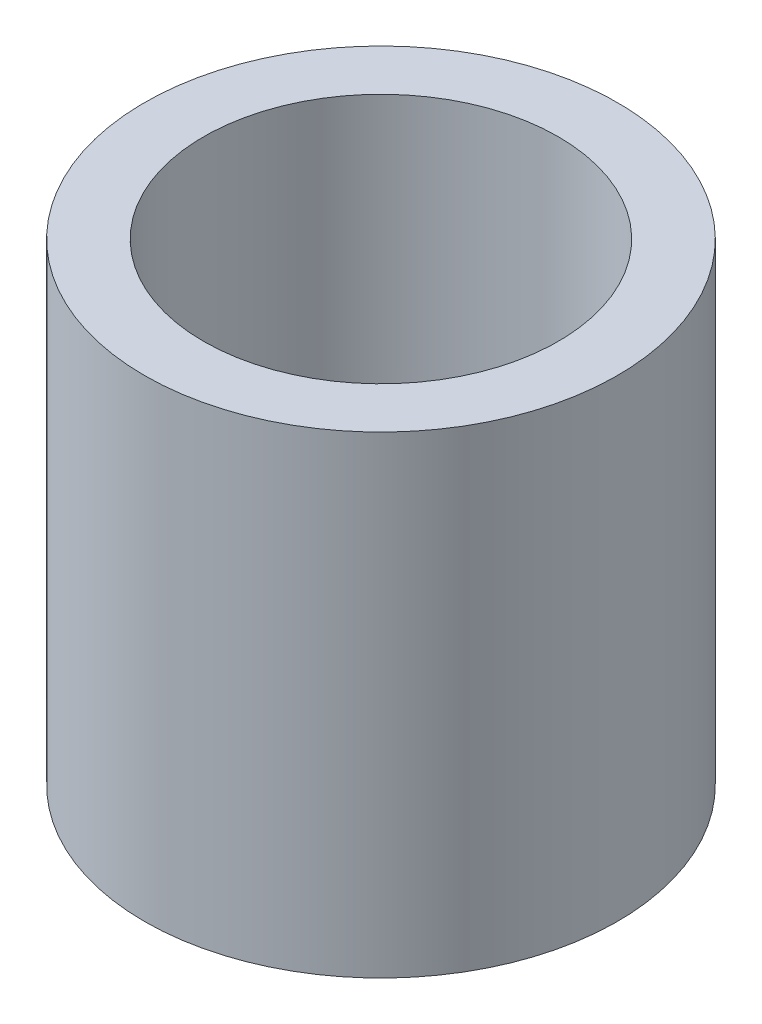
ISO-10303-21;
HEADER;
FILE_DESCRIPTION(('STEP AP214'),'2;1');
FILE_NAME('part.step','',(''),(''),'','','');
FILE_SCHEMA(('AUTOMOTIVE_DESIGN { 1 0 10303 214 1 1 1 1 }'));
ENDSEC;
DATA;
#1=APPLICATION_CONTEXT('core data for automotive mechanical design processes');
#2=APPLICATION_PROTOCOL_DEFINITION('international standard','automotive_design',2000,#1);
#3=PRODUCT_CONTEXT('',#1,'mechanical');
#4=PRODUCT('Part','Part','',(#3));
#5=PRODUCT_RELATED_PRODUCT_CATEGORY('part','',(#4));
#6=PRODUCT_DEFINITION_FORMATION('','',#4);
#7=PRODUCT_DEFINITION_CONTEXT('part definition',#1,'design');
#8=PRODUCT_DEFINITION('design','',#6,#7);
#9=PRODUCT_DEFINITION_SHAPE('','',#8);
#10=(LENGTH_UNIT() NAMED_UNIT(*) SI_UNIT(.MILLI.,.METRE.));
#11=(NAMED_UNIT(*) PLANE_ANGLE_UNIT() SI_UNIT($,.RADIAN.));
#12=(NAMED_UNIT(*) SI_UNIT($,.STERADIAN.) SOLID_ANGLE_UNIT());
#13=UNCERTAINTY_MEASURE_WITH_UNIT(LENGTH_MEASURE(1.E-05),#10,'distance_accuracy_value','');
#14=(GEOMETRIC_REPRESENTATION_CONTEXT(3) GLOBAL_UNCERTAINTY_ASSIGNED_CONTEXT((#13)) GLOBAL_UNIT_ASSIGNED_CONTEXT((#10,
#11,#12)) REPRESENTATION_CONTEXT('',''));
#15=CARTESIAN_POINT('',(0.,0.,0.));
#16=DIRECTION('',(0.,0.,1.));
#17=DIRECTION('',(1.,0.,0.));
#18=AXIS2_PLACEMENT_3D('',#15,#16,#17);
#19=CARTESIAN_POINT('',(0.,2.,0.));
#20=DIRECTION('',(0.,1.,0.));
#21=DIRECTION('',(0.,0.,1.));
#22=AXIS2_PLACEMENT_3D('',#19,#20,#21);
#23=PLANE('',#22);
#24=CARTESIAN_POINT('',(0.,2.,0.));
#25=DIRECTION('',(0.,1.,0.));
#26=DIRECTION('',(0.,0.,1.));
#27=AXIS2_PLACEMENT_3D('',#24,#25,#26);
#28=CIRCLE('',#27,2.);
#29=CARTESIAN_POINT('',(0.,2.,2.));
#30=VERTEX_POINT('',#29);
#31=EDGE_CURVE('E10',#30,#30,#28,.T.);
#32=ORIENTED_EDGE('',*,*,#31,.T.);
#33=EDGE_LOOP('',(#32));
#34=FACE_BOUND('',#33,.T.);
#35=CARTESIAN_POINT('',(0.,2.,0.));
#36=DIRECTION('',(0.,1.,0.));
#37=DIRECTION('',(0.,0.,1.));
#38=AXIS2_PLACEMENT_3D('',#35,#36,#37);
#39=CIRCLE('',#38,1.5);
#40=CARTESIAN_POINT('',(0.,2.,1.5));
#41=VERTEX_POINT('',#40);
#42=EDGE_CURVE('E45',#41,#41,#39,.T.);
#43=ORIENTED_EDGE('',*,*,#42,.F.);
#44=EDGE_LOOP('',(#43));
#45=FACE_BOUND('',#44,.T.);
#46=ADVANCED_FACE('F34',(#34,#45),#23,.T.);
#47=CARTESIAN_POINT('',(0.,-2.,0.));
#48=DIRECTION('',(0.,1.,0.));
#49=DIRECTION('',(0.,0.,1.));
#50=AXIS2_PLACEMENT_3D('',#47,#48,#49);
#51=PLANE('',#50);
#52=CARTESIAN_POINT('',(0.,-2.,0.));
#53=DIRECTION('',(0.,1.,0.));
#54=DIRECTION('',(0.,0.,1.));
#55=AXIS2_PLACEMENT_3D('',#52,#53,#54);
#56=CIRCLE('',#55,2.);
#57=CARTESIAN_POINT('',(0.,-2.,2.));
#58=VERTEX_POINT('',#57);
#59=EDGE_CURVE('E38',#58,#58,#56,.T.);
#60=ORIENTED_EDGE('',*,*,#59,.F.);
#61=EDGE_LOOP('',(#60));
#62=FACE_BOUND('',#61,.T.);
#63=CARTESIAN_POINT('',(0.,-2.,0.));
#64=DIRECTION('',(0.,1.,0.));
#65=DIRECTION('',(0.,0.,1.));
#66=AXIS2_PLACEMENT_3D('',#63,#64,#65);
#67=CIRCLE('',#66,1.5);
#68=CARTESIAN_POINT('',(0.,-2.,1.5));
#69=VERTEX_POINT('',#68);
#70=EDGE_CURVE('E47',#69,#69,#67,.T.);
#71=ORIENTED_EDGE('',*,*,#70,.T.);
#72=EDGE_LOOP('',(#71));
#73=FACE_BOUND('',#72,.T.);
#74=ADVANCED_FACE('F57',(#62,#73),#51,.F.);
#75=CARTESIAN_POINT('',(0.,2.,0.));
#76=DIRECTION('',(0.,-1.,0.));
#77=DIRECTION('',(0.,0.,-1.));
#78=AXIS2_PLACEMENT_3D('',#75,#76,#77);
#79=CYLINDRICAL_SURFACE('',#78,2.);
#80=ORIENTED_EDGE('',*,*,#31,.F.);
#81=EDGE_LOOP('',(#80));
#82=FACE_BOUND('',#81,.T.);
#83=ORIENTED_EDGE('',*,*,#59,.T.);
#84=EDGE_LOOP('',(#83));
#85=FACE_BOUND('',#84,.T.);
#86=ADVANCED_FACE('F36',(#82,#85),#79,.T.);
#87=CARTESIAN_POINT('',(0.,2.,0.));
#88=DIRECTION('',(0.,-1.,0.));
#89=DIRECTION('',(0.,0.,-1.));
#90=AXIS2_PLACEMENT_3D('',#87,#88,#89);
#91=CYLINDRICAL_SURFACE('',#90,1.5);
#92=ORIENTED_EDGE('',*,*,#42,.T.);
#93=EDGE_LOOP('',(#92));
#94=FACE_BOUND('',#93,.T.);
#95=ORIENTED_EDGE('',*,*,#70,.F.);
#96=EDGE_LOOP('',(#95));
#97=FACE_BOUND('',#96,.T.);
#98=ADVANCED_FACE('F53',(#94,#97),#91,.F.);
#99=CLOSED_SHELL('',(#46,#74,#86,#98));
#100=MANIFOLD_SOLID_BREP('B2',#99);
#101=ADVANCED_BREP_SHAPE_REPRESENTATION('',(#18,#100),#14);
#102=SHAPE_DEFINITION_REPRESENTATION(#9,#101);
ENDSEC;
END-ISO-10303-21;
